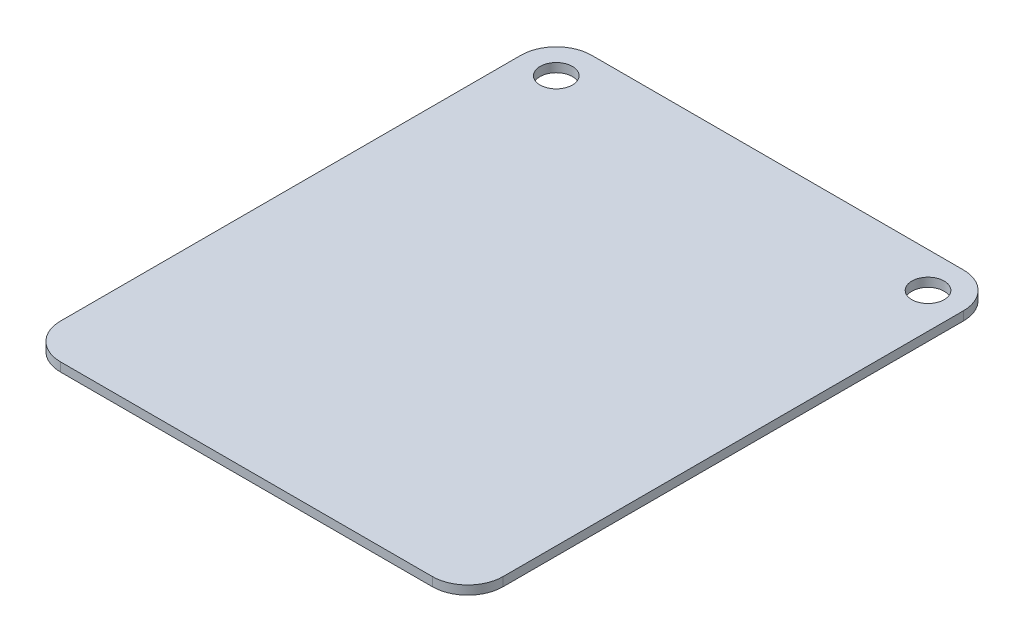
ISO-10303-21;
HEADER;
FILE_DESCRIPTION(('STEP AP214'),'2;1');
FILE_NAME('part.step','',(''),(''),'','','');
FILE_SCHEMA(('AUTOMOTIVE_DESIGN { 1 0 10303 214 1 1 1 1 }'));
ENDSEC;
DATA;
#1=APPLICATION_CONTEXT('core data for automotive mechanical design processes');
#2=APPLICATION_PROTOCOL_DEFINITION('international standard','automotive_design',2000,#1);
#3=PRODUCT_CONTEXT('',#1,'mechanical');
#4=PRODUCT('Part','Part','',(#3));
#5=PRODUCT_RELATED_PRODUCT_CATEGORY('part','',(#4));
#6=PRODUCT_DEFINITION_FORMATION('','',#4);
#7=PRODUCT_DEFINITION_CONTEXT('part definition',#1,'design');
#8=PRODUCT_DEFINITION('design','',#6,#7);
#9=PRODUCT_DEFINITION_SHAPE('','',#8);
#10=(LENGTH_UNIT() NAMED_UNIT(*) SI_UNIT(.MILLI.,.METRE.));
#11=(NAMED_UNIT(*) PLANE_ANGLE_UNIT() SI_UNIT($,.RADIAN.));
#12=(NAMED_UNIT(*) SI_UNIT($,.STERADIAN.) SOLID_ANGLE_UNIT());
#13=UNCERTAINTY_MEASURE_WITH_UNIT(LENGTH_MEASURE(1.E-05),#10,'distance_accuracy_value','');
#14=(GEOMETRIC_REPRESENTATION_CONTEXT(3) GLOBAL_UNCERTAINTY_ASSIGNED_CONTEXT((#13)) GLOBAL_UNIT_ASSIGNED_CONTEXT((#10,
#11,#12)) REPRESENTATION_CONTEXT('',''));
#15=CARTESIAN_POINT('',(0.,0.,0.));
#16=DIRECTION('',(0.,0.,1.));
#17=DIRECTION('',(1.,0.,0.));
#18=AXIS2_PLACEMENT_3D('',#15,#16,#17);
#19=CARTESIAN_POINT('',(-21.,1.,26.));
#20=DIRECTION('',(0.,1.,0.));
#21=DIRECTION('',(0.,0.,1.));
#22=AXIS2_PLACEMENT_3D('',#19,#20,#21);
#23=PLANE('',#22);
#24=CARTESIAN_POINT('',(-21.,1.,-26.));
#25=DIRECTION('',(0.,1.,0.));
#26=DIRECTION('',(0.,0.,1.));
#27=AXIS2_PLACEMENT_3D('',#24,#25,#26);
#28=CIRCLE('',#27,1.825);
#29=CARTESIAN_POINT('',(-21.,1.,-24.175));
#30=VERTEX_POINT('',#29);
#31=EDGE_CURVE('E134',#30,#30,#28,.T.);
#32=ORIENTED_EDGE('',*,*,#31,.F.);
#33=EDGE_LOOP('',(#32));
#34=FACE_BOUND('',#33,.T.);
#35=CARTESIAN_POINT('',(-21.,1.,26.));
#36=DIRECTION('',(0.,1.,0.));
#37=DIRECTION('',(0.,0.,1.));
#38=AXIS2_PLACEMENT_3D('',#35,#36,#37);
#39=CIRCLE('',#38,4.);
#40=CARTESIAN_POINT('',(-25.,1.,26.));
#41=VERTEX_POINT('',#40);
#42=CARTESIAN_POINT('',(-21.,1.,30.));
#43=VERTEX_POINT('',#42);
#44=EDGE_CURVE('E145',#41,#43,#39,.T.);
#45=ORIENTED_EDGE('',*,*,#44,.T.);
#46=DIRECTION('',(1.,0.,0.));
#47=VECTOR('',#46,1.);
#48=CARTESIAN_POINT('',(-21.,1.,30.));
#49=LINE('',#48,#47);
#50=CARTESIAN_POINT('',(21.,1.,30.));
#51=VERTEX_POINT('',#50);
#52=EDGE_CURVE('E93',#43,#51,#49,.T.);
#53=ORIENTED_EDGE('',*,*,#52,.T.);
#54=CARTESIAN_POINT('',(21.,1.,26.));
#55=DIRECTION('',(0.,1.,0.));
#56=DIRECTION('',(0.,0.,1.));
#57=AXIS2_PLACEMENT_3D('',#54,#55,#56);
#58=CIRCLE('',#57,4.);
#59=CARTESIAN_POINT('',(25.,1.,26.));
#60=VERTEX_POINT('',#59);
#61=EDGE_CURVE('E160',#51,#60,#58,.T.);
#62=ORIENTED_EDGE('',*,*,#61,.T.);
#63=DIRECTION('',(0.,0.,-1.));
#64=VECTOR('',#63,1.);
#65=CARTESIAN_POINT('',(25.,1.,-26.));
#66=LINE('',#65,#64);
#67=CARTESIAN_POINT('',(25.,1.,-26.));
#68=VERTEX_POINT('',#67);
#69=EDGE_CURVE('E173',#60,#68,#66,.T.);
#70=ORIENTED_EDGE('',*,*,#69,.T.);
#71=CARTESIAN_POINT('',(21.,1.,-26.));
#72=DIRECTION('',(0.,1.,0.));
#73=DIRECTION('',(0.,0.,-1.));
#74=AXIS2_PLACEMENT_3D('',#71,#72,#73);
#75=CIRCLE('',#74,4.);
#76=CARTESIAN_POINT('',(21.,1.,-30.));
#77=VERTEX_POINT('',#76);
#78=EDGE_CURVE('E112',#68,#77,#75,.T.);
#79=ORIENTED_EDGE('',*,*,#78,.T.);
#80=DIRECTION('',(-1.,0.,0.));
#81=VECTOR('',#80,1.);
#82=CARTESIAN_POINT('',(-21.,1.,-30.));
#83=LINE('',#82,#81);
#84=CARTESIAN_POINT('',(-21.,1.,-30.));
#85=VERTEX_POINT('',#84);
#86=EDGE_CURVE('E106',#77,#85,#83,.T.);
#87=ORIENTED_EDGE('',*,*,#86,.T.);
#88=CARTESIAN_POINT('',(-21.,1.,-26.));
#89=DIRECTION('',(0.,1.,0.));
#90=DIRECTION('',(0.,0.,1.));
#91=AXIS2_PLACEMENT_3D('',#88,#89,#90);
#92=CIRCLE('',#91,4.);
#93=CARTESIAN_POINT('',(-25.,1.,-26.));
#94=VERTEX_POINT('',#93);
#95=EDGE_CURVE('E110',#85,#94,#92,.T.);
#96=ORIENTED_EDGE('',*,*,#95,.T.);
#97=DIRECTION('',(0.,0.,1.));
#98=VECTOR('',#97,1.);
#99=CARTESIAN_POINT('',(-25.,1.,-26.));
#100=LINE('',#99,#98);
#101=EDGE_CURVE('E50',#94,#41,#100,.T.);
#102=ORIENTED_EDGE('',*,*,#101,.T.);
#103=EDGE_LOOP('',(#45,#53,#62,#70,#79,#87,#96,#102));
#104=FACE_BOUND('',#103,.T.);
#105=CARTESIAN_POINT('',(21.,1.,-26.));
#106=DIRECTION('',(0.,1.,0.));
#107=DIRECTION('',(0.,0.,-1.));
#108=AXIS2_PLACEMENT_3D('',#105,#106,#107);
#109=CIRCLE('',#108,1.825);
#110=CARTESIAN_POINT('',(21.,1.,-27.825));
#111=VERTEX_POINT('',#110);
#112=EDGE_CURVE('E182',#111,#111,#109,.T.);
#113=ORIENTED_EDGE('',*,*,#112,.F.);
#114=EDGE_LOOP('',(#113));
#115=FACE_BOUND('',#114,.T.);
#116=ADVANCED_FACE('F33',(#34,#104,#115),#23,.T.);
#117=CARTESIAN_POINT('',(-21.,0.,26.));
#118=DIRECTION('',(0.,1.,0.));
#119=DIRECTION('',(0.,0.,1.));
#120=AXIS2_PLACEMENT_3D('',#117,#118,#119);
#121=PLANE('',#120);
#122=CARTESIAN_POINT('',(-21.,0.,26.));
#123=DIRECTION('',(0.,1.,0.));
#124=DIRECTION('',(0.,0.,1.));
#125=AXIS2_PLACEMENT_3D('',#122,#123,#124);
#126=CIRCLE('',#125,4.);
#127=CARTESIAN_POINT('',(-25.,0.,26.));
#128=VERTEX_POINT('',#127);
#129=CARTESIAN_POINT('',(-21.,0.,30.));
#130=VERTEX_POINT('',#129);
#131=EDGE_CURVE('E130',#128,#130,#126,.T.);
#132=ORIENTED_EDGE('',*,*,#131,.F.);
#133=DIRECTION('',(0.,0.,1.));
#134=VECTOR('',#133,1.);
#135=CARTESIAN_POINT('',(-25.,0.,-26.));
#136=LINE('',#135,#134);
#137=CARTESIAN_POINT('',(-25.,0.,-26.));
#138=VERTEX_POINT('',#137);
#139=EDGE_CURVE('E85',#138,#128,#136,.T.);
#140=ORIENTED_EDGE('',*,*,#139,.F.);
#141=CARTESIAN_POINT('',(-21.,0.,-26.));
#142=DIRECTION('',(0.,1.,0.));
#143=DIRECTION('',(0.,0.,1.));
#144=AXIS2_PLACEMENT_3D('',#141,#142,#143);
#145=CIRCLE('',#144,4.);
#146=CARTESIAN_POINT('',(-21.,0.,-30.));
#147=VERTEX_POINT('',#146);
#148=EDGE_CURVE('E79',#147,#138,#145,.T.);
#149=ORIENTED_EDGE('',*,*,#148,.F.);
#150=DIRECTION('',(-1.,0.,0.));
#151=VECTOR('',#150,1.);
#152=CARTESIAN_POINT('',(-21.,0.,-30.));
#153=LINE('',#152,#151);
#154=CARTESIAN_POINT('',(21.,0.,-30.));
#155=VERTEX_POINT('',#154);
#156=EDGE_CURVE('E120',#155,#147,#153,.T.);
#157=ORIENTED_EDGE('',*,*,#156,.F.);
#158=CARTESIAN_POINT('',(21.,0.,-26.));
#159=DIRECTION('',(0.,1.,0.));
#160=DIRECTION('',(0.,0.,-1.));
#161=AXIS2_PLACEMENT_3D('',#158,#159,#160);
#162=CIRCLE('',#161,4.);
#163=CARTESIAN_POINT('',(25.,0.,-26.));
#164=VERTEX_POINT('',#163);
#165=EDGE_CURVE('E140',#164,#155,#162,.T.);
#166=ORIENTED_EDGE('',*,*,#165,.F.);
#167=DIRECTION('',(0.,0.,-1.));
#168=VECTOR('',#167,1.);
#169=CARTESIAN_POINT('',(25.,0.,-26.));
#170=LINE('',#169,#168);
#171=CARTESIAN_POINT('',(25.,0.,26.));
#172=VERTEX_POINT('',#171);
#173=EDGE_CURVE('E138',#172,#164,#170,.T.);
#174=ORIENTED_EDGE('',*,*,#173,.F.);
#175=CARTESIAN_POINT('',(21.,0.,26.));
#176=DIRECTION('',(0.,1.,0.));
#177=DIRECTION('',(0.,0.,1.));
#178=AXIS2_PLACEMENT_3D('',#175,#176,#177);
#179=CIRCLE('',#178,4.);
#180=CARTESIAN_POINT('',(21.,0.,30.));
#181=VERTEX_POINT('',#180);
#182=EDGE_CURVE('E136',#181,#172,#179,.T.);
#183=ORIENTED_EDGE('',*,*,#182,.F.);
#184=DIRECTION('',(1.,0.,0.));
#185=VECTOR('',#184,1.);
#186=CARTESIAN_POINT('',(-21.,0.,30.));
#187=LINE('',#186,#185);
#188=EDGE_CURVE('E133',#130,#181,#187,.T.);
#189=ORIENTED_EDGE('',*,*,#188,.F.);
#190=EDGE_LOOP('',(#132,#140,#149,#157,#166,#174,#183,#189));
#191=FACE_BOUND('',#190,.T.);
#192=CARTESIAN_POINT('',(-21.,0.,-26.));
#193=DIRECTION('',(0.,1.,0.));
#194=DIRECTION('',(0.,0.,1.));
#195=AXIS2_PLACEMENT_3D('',#192,#193,#194);
#196=CIRCLE('',#195,1.825);
#197=CARTESIAN_POINT('',(-21.,0.,-24.175));
#198=VERTEX_POINT('',#197);
#199=EDGE_CURVE('E179',#198,#198,#196,.T.);
#200=ORIENTED_EDGE('',*,*,#199,.T.);
#201=EDGE_LOOP('',(#200));
#202=FACE_BOUND('',#201,.T.);
#203=CARTESIAN_POINT('',(21.,0.,-26.));
#204=DIRECTION('',(0.,1.,0.));
#205=DIRECTION('',(0.,0.,-1.));
#206=AXIS2_PLACEMENT_3D('',#203,#204,#205);
#207=CIRCLE('',#206,1.825);
#208=CARTESIAN_POINT('',(21.,0.,-27.825));
#209=VERTEX_POINT('',#208);
#210=EDGE_CURVE('E185',#209,#209,#207,.T.);
#211=ORIENTED_EDGE('',*,*,#210,.T.);
#212=EDGE_LOOP('',(#211));
#213=FACE_BOUND('',#212,.T.);
#214=ADVANCED_FACE('F164',(#191,#202,#213),#121,.F.);
#215=CARTESIAN_POINT('',(-21.,1.,26.));
#216=DIRECTION('',(0.,-1.,0.));
#217=DIRECTION('',(0.,0.,-1.));
#218=AXIS2_PLACEMENT_3D('',#215,#216,#217);
#219=CYLINDRICAL_SURFACE('',#218,4.);
#220=ORIENTED_EDGE('',*,*,#131,.T.);
#221=DIRECTION('',(0.,-1.,0.));
#222=VECTOR('',#221,1.);
#223=CARTESIAN_POINT('',(-21.,1.,30.));
#224=LINE('',#223,#222);
#225=EDGE_CURVE('E11',#43,#130,#224,.T.);
#226=ORIENTED_EDGE('',*,*,#225,.F.);
#227=ORIENTED_EDGE('',*,*,#44,.F.);
#228=DIRECTION('',(0.,-1.,0.));
#229=VECTOR('',#228,1.);
#230=CARTESIAN_POINT('',(-25.,1.,26.));
#231=LINE('',#230,#229);
#232=EDGE_CURVE('E126',#41,#128,#231,.T.);
#233=ORIENTED_EDGE('',*,*,#232,.T.);
#234=EDGE_LOOP('',(#220,#226,#227,#233));
#235=FACE_BOUND('',#234,.T.);
#236=ADVANCED_FACE('F35',(#235),#219,.T.);
#237=CARTESIAN_POINT('',(-21.,1.,30.));
#238=DIRECTION('',(0.,0.,-1.));
#239=DIRECTION('',(-1.,0.,0.));
#240=AXIS2_PLACEMENT_3D('',#237,#238,#239);
#241=PLANE('',#240);
#242=ORIENTED_EDGE('',*,*,#188,.T.);
#243=DIRECTION('',(0.,-1.,0.));
#244=VECTOR('',#243,1.);
#245=CARTESIAN_POINT('',(21.,1.,30.));
#246=LINE('',#245,#244);
#247=EDGE_CURVE('E42',#51,#181,#246,.T.);
#248=ORIENTED_EDGE('',*,*,#247,.F.);
#249=ORIENTED_EDGE('',*,*,#52,.F.);
#250=ORIENTED_EDGE('',*,*,#225,.T.);
#251=EDGE_LOOP('',(#242,#248,#249,#250));
#252=FACE_BOUND('',#251,.T.);
#253=ADVANCED_FACE('F217',(#252),#241,.F.);
#254=CARTESIAN_POINT('',(21.,1.,26.));
#255=DIRECTION('',(0.,-1.,0.));
#256=DIRECTION('',(0.,0.,-1.));
#257=AXIS2_PLACEMENT_3D('',#254,#255,#256);
#258=CYLINDRICAL_SURFACE('',#257,4.);
#259=ORIENTED_EDGE('',*,*,#182,.T.);
#260=DIRECTION('',(0.,-1.,0.));
#261=VECTOR('',#260,1.);
#262=CARTESIAN_POINT('',(25.,1.,26.));
#263=LINE('',#262,#261);
#264=EDGE_CURVE('E152',#60,#172,#263,.T.);
#265=ORIENTED_EDGE('',*,*,#264,.F.);
#266=ORIENTED_EDGE('',*,*,#61,.F.);
#267=ORIENTED_EDGE('',*,*,#247,.T.);
#268=EDGE_LOOP('',(#259,#265,#266,#267));
#269=FACE_BOUND('',#268,.T.);
#270=ADVANCED_FACE('F158',(#269),#258,.T.);
#271=CARTESIAN_POINT('',(25.,1.,-26.));
#272=DIRECTION('',(-1.,0.,0.));
#273=DIRECTION('',(0.,0.,1.));
#274=AXIS2_PLACEMENT_3D('',#271,#272,#273);
#275=PLANE('',#274);
#276=ORIENTED_EDGE('',*,*,#173,.T.);
#277=DIRECTION('',(0.,-1.,0.));
#278=VECTOR('',#277,1.);
#279=CARTESIAN_POINT('',(25.,1.,-26.));
#280=LINE('',#279,#278);
#281=EDGE_CURVE('E149',#68,#164,#280,.T.);
#282=ORIENTED_EDGE('',*,*,#281,.F.);
#283=ORIENTED_EDGE('',*,*,#69,.F.);
#284=ORIENTED_EDGE('',*,*,#264,.T.);
#285=EDGE_LOOP('',(#276,#282,#283,#284));
#286=FACE_BOUND('',#285,.T.);
#287=ADVANCED_FACE('F169',(#286),#275,.F.);
#288=CARTESIAN_POINT('',(21.,1.,-26.));
#289=DIRECTION('',(0.,-1.,0.));
#290=DIRECTION('',(0.,0.,-1.));
#291=AXIS2_PLACEMENT_3D('',#288,#289,#290);
#292=CYLINDRICAL_SURFACE('',#291,4.);
#293=ORIENTED_EDGE('',*,*,#165,.T.);
#294=DIRECTION('',(0.,-1.,0.));
#295=VECTOR('',#294,1.);
#296=CARTESIAN_POINT('',(21.,1.,-30.));
#297=LINE('',#296,#295);
#298=EDGE_CURVE('E121',#77,#155,#297,.T.);
#299=ORIENTED_EDGE('',*,*,#298,.F.);
#300=ORIENTED_EDGE('',*,*,#78,.F.);
#301=ORIENTED_EDGE('',*,*,#281,.T.);
#302=EDGE_LOOP('',(#293,#299,#300,#301));
#303=FACE_BOUND('',#302,.T.);
#304=ADVANCED_FACE('F172',(#303),#292,.T.);
#305=CARTESIAN_POINT('',(-21.,1.,-30.));
#306=DIRECTION('',(0.,0.,1.));
#307=DIRECTION('',(1.,0.,0.));
#308=AXIS2_PLACEMENT_3D('',#305,#306,#307);
#309=PLANE('',#308);
#310=ORIENTED_EDGE('',*,*,#156,.T.);
#311=DIRECTION('',(0.,-1.,0.));
#312=VECTOR('',#311,1.);
#313=CARTESIAN_POINT('',(-21.,1.,-30.));
#314=LINE('',#313,#312);
#315=EDGE_CURVE('E117',#85,#147,#314,.T.);
#316=ORIENTED_EDGE('',*,*,#315,.F.);
#317=ORIENTED_EDGE('',*,*,#86,.F.);
#318=ORIENTED_EDGE('',*,*,#298,.T.);
#319=EDGE_LOOP('',(#310,#316,#317,#318));
#320=FACE_BOUND('',#319,.T.);
#321=ADVANCED_FACE('F118',(#320),#309,.F.);
#322=CARTESIAN_POINT('',(-21.,1.,-26.));
#323=DIRECTION('',(0.,-1.,0.));
#324=DIRECTION('',(0.,0.,-1.));
#325=AXIS2_PLACEMENT_3D('',#322,#323,#324);
#326=CYLINDRICAL_SURFACE('',#325,4.);
#327=ORIENTED_EDGE('',*,*,#148,.T.);
#328=DIRECTION('',(0.,-1.,0.));
#329=VECTOR('',#328,1.);
#330=CARTESIAN_POINT('',(-25.,1.,-26.));
#331=LINE('',#330,#329);
#332=EDGE_CURVE('E122',#94,#138,#331,.T.);
#333=ORIENTED_EDGE('',*,*,#332,.F.);
#334=ORIENTED_EDGE('',*,*,#95,.F.);
#335=ORIENTED_EDGE('',*,*,#315,.T.);
#336=EDGE_LOOP('',(#327,#333,#334,#335));
#337=FACE_BOUND('',#336,.T.);
#338=ADVANCED_FACE('F124',(#337),#326,.T.);
#339=CARTESIAN_POINT('',(-25.,1.,-26.));
#340=DIRECTION('',(1.,0.,0.));
#341=DIRECTION('',(0.,0.,-1.));
#342=AXIS2_PLACEMENT_3D('',#339,#340,#341);
#343=PLANE('',#342);
#344=ORIENTED_EDGE('',*,*,#139,.T.);
#345=ORIENTED_EDGE('',*,*,#232,.F.);
#346=ORIENTED_EDGE('',*,*,#101,.F.);
#347=ORIENTED_EDGE('',*,*,#332,.T.);
#348=EDGE_LOOP('',(#344,#345,#346,#347));
#349=FACE_BOUND('',#348,.T.);
#350=ADVANCED_FACE('F205',(#349),#343,.F.);
#351=CARTESIAN_POINT('',(-21.,1.,-26.));
#352=DIRECTION('',(0.,-1.,0.));
#353=DIRECTION('',(0.,0.,-1.));
#354=AXIS2_PLACEMENT_3D('',#351,#352,#353);
#355=CYLINDRICAL_SURFACE('',#354,1.825);
#356=ORIENTED_EDGE('',*,*,#31,.T.);
#357=EDGE_LOOP('',(#356));
#358=FACE_BOUND('',#357,.T.);
#359=ORIENTED_EDGE('',*,*,#199,.F.);
#360=EDGE_LOOP('',(#359));
#361=FACE_BOUND('',#360,.T.);
#362=ADVANCED_FACE('F202',(#358,#361),#355,.F.);
#363=CARTESIAN_POINT('',(21.,1.,-26.));
#364=DIRECTION('',(0.,-1.,0.));
#365=DIRECTION('',(0.,0.,-1.));
#366=AXIS2_PLACEMENT_3D('',#363,#364,#365);
#367=CYLINDRICAL_SURFACE('',#366,1.825);
#368=ORIENTED_EDGE('',*,*,#112,.T.);
#369=EDGE_LOOP('',(#368));
#370=FACE_BOUND('',#369,.T.);
#371=ORIENTED_EDGE('',*,*,#210,.F.);
#372=EDGE_LOOP('',(#371));
#373=FACE_BOUND('',#372,.T.);
#374=ADVANCED_FACE('F191',(#370,#373),#367,.F.);
#375=CLOSED_SHELL('',(#116,#214,#236,#253,#270,#287,#304,#321,#338,#350,#362,#374));
#376=MANIFOLD_SOLID_BREP('B2',#375);
#377=ADVANCED_BREP_SHAPE_REPRESENTATION('',(#18,#376),#14);
#378=SHAPE_DEFINITION_REPRESENTATION(#9,#377);
ENDSEC;
END-ISO-10303-21;
